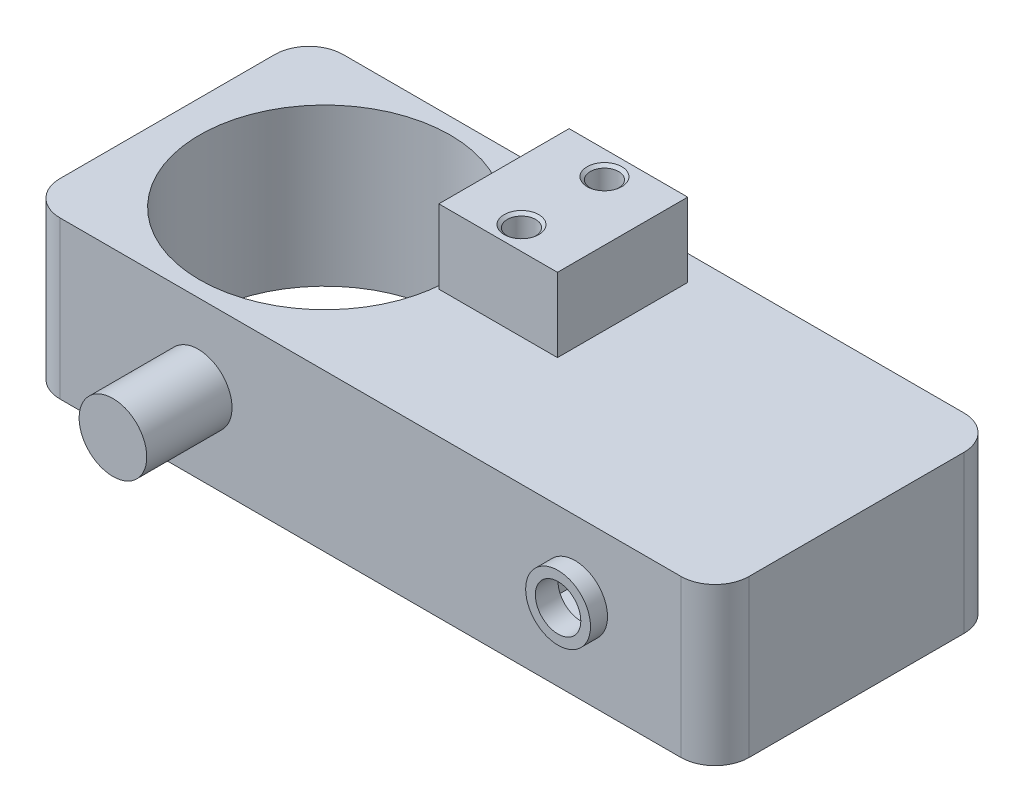
ISO-10303-21;
HEADER;
FILE_DESCRIPTION(('STEP AP214'),'2;1');
FILE_NAME('part.step','',(''),(''),'','','');
FILE_SCHEMA(('AUTOMOTIVE_DESIGN { 1 0 10303 214 1 1 1 1 }'));
ENDSEC;
DATA;
#1=APPLICATION_CONTEXT('core data for automotive mechanical design processes');
#2=APPLICATION_PROTOCOL_DEFINITION('international standard','automotive_design',2000,#1);
#3=PRODUCT_CONTEXT('',#1,'mechanical');
#4=PRODUCT('Part','Part','',(#3));
#5=PRODUCT_RELATED_PRODUCT_CATEGORY('part','',(#4));
#6=PRODUCT_DEFINITION_FORMATION('','',#4);
#7=PRODUCT_DEFINITION_CONTEXT('part definition',#1,'design');
#8=PRODUCT_DEFINITION('design','',#6,#7);
#9=PRODUCT_DEFINITION_SHAPE('','',#8);
#10=(LENGTH_UNIT() NAMED_UNIT(*) SI_UNIT(.MILLI.,.METRE.));
#11=(NAMED_UNIT(*) PLANE_ANGLE_UNIT() SI_UNIT($,.RADIAN.));
#12=(NAMED_UNIT(*) SI_UNIT($,.STERADIAN.) SOLID_ANGLE_UNIT());
#13=UNCERTAINTY_MEASURE_WITH_UNIT(LENGTH_MEASURE(1.E-05),#10,'distance_accuracy_value','');
#14=(GEOMETRIC_REPRESENTATION_CONTEXT(3) GLOBAL_UNCERTAINTY_ASSIGNED_CONTEXT((#13)) GLOBAL_UNIT_ASSIGNED_CONTEXT((#10,
#11,#12)) REPRESENTATION_CONTEXT('',''));
#15=CARTESIAN_POINT('',(0.,0.,0.));
#16=DIRECTION('',(0.,0.,1.));
#17=DIRECTION('',(1.,0.,0.));
#18=AXIS2_PLACEMENT_3D('',#15,#16,#17);
#19=CARTESIAN_POINT('',(-30.303823575,13.8,12.447970491281));
#20=DIRECTION('',(0.,0.,-1.));
#21=DIRECTION('',(-1.,0.,0.));
#22=AXIS2_PLACEMENT_3D('',#19,#20,#21);
#23=PLANE('',#22);
#24=DIRECTION('',(1.,0.,0.));
#25=VECTOR('',#24,1.);
#26=CARTESIAN_POINT('',(-30.303823575,0.,12.447970491281));
#27=LINE('',#26,#25);
#28=CARTESIAN_POINT('',(-27.303823575,0.,12.447970491281));
#29=VERTEX_POINT('',#28);
#30=CARTESIAN_POINT('',(27.303823575,0.,12.447970491281));
#31=VERTEX_POINT('',#30);
#32=EDGE_CURVE('E233',#29,#31,#27,.T.);
#33=ORIENTED_EDGE('',*,*,#32,.T.);
#34=DIRECTION('',(0.,-1.,0.));
#35=VECTOR('',#34,1.);
#36=CARTESIAN_POINT('',(27.303823575,13.8,12.447970491281));
#37=LINE('',#36,#35);
#38=CARTESIAN_POINT('',(27.303823575,13.8,12.447970491281));
#39=VERTEX_POINT('',#38);
#40=EDGE_CURVE('E56',#31,#39,#37,.F.);
#41=ORIENTED_EDGE('',*,*,#40,.T.);
#42=DIRECTION('',(1.,0.,0.));
#43=VECTOR('',#42,1.);
#44=CARTESIAN_POINT('',(-30.303823575,13.8,12.447970491281));
#45=LINE('',#44,#43);
#46=CARTESIAN_POINT('',(-27.303823575,13.8,12.447970491281));
#47=VERTEX_POINT('',#46);
#48=EDGE_CURVE('E238',#47,#39,#45,.T.);
#49=ORIENTED_EDGE('',*,*,#48,.F.);
#50=DIRECTION('',(0.,-1.,0.));
#51=VECTOR('',#50,1.);
#52=CARTESIAN_POINT('',(-27.303823575,13.8,12.447970491281));
#53=LINE('',#52,#51);
#54=EDGE_CURVE('E264',#47,#29,#53,.T.);
#55=ORIENTED_EDGE('',*,*,#54,.T.);
#56=EDGE_LOOP('',(#33,#41,#49,#55));
#57=FACE_BOUND('',#56,.T.);
#58=CARTESIAN_POINT('',(-15.1519117875,6.9,12.447970491281));
#59=DIRECTION('',(0.,0.,-1.));
#60=DIRECTION('',(-1.,0.,0.));
#61=AXIS2_PLACEMENT_3D('',#58,#59,#60);
#62=CIRCLE('',#61,2.975);
#63=CARTESIAN_POINT('',(-18.1269117875,6.9,12.447970491281));
#64=VERTEX_POINT('',#63);
#65=EDGE_CURVE('E240',#64,#64,#62,.F.);
#66=ORIENTED_EDGE('',*,*,#65,.F.);
#67=EDGE_LOOP('',(#66));
#68=FACE_BOUND('',#67,.T.);
#69=CARTESIAN_POINT('',(18.,7.5,12.447970491281));
#70=DIRECTION('',(0.,0.,-1.));
#71=DIRECTION('',(-1.,0.,0.));
#72=AXIS2_PLACEMENT_3D('',#69,#70,#71);
#73=CIRCLE('',#72,2.85048671445384);
#74=CARTESIAN_POINT('',(15.1495132855462,7.5,12.447970491281));
#75=VERTEX_POINT('',#74);
#76=EDGE_CURVE('E250',#75,#75,#73,.F.);
#77=ORIENTED_EDGE('',*,*,#76,.F.);
#78=EDGE_LOOP('',(#77));
#79=FACE_BOUND('',#78,.T.);
#80=ADVANCED_FACE('F48',(#57,#68,#79),#23,.F.);
#81=CARTESIAN_POINT('',(0.,13.8,0.));
#82=DIRECTION('',(0.,1.,0.));
#83=DIRECTION('',(0.,0.,1.));
#84=AXIS2_PLACEMENT_3D('',#81,#82,#83);
#85=PLANE('',#84);
#86=CARTESIAN_POINT('',(-16.4607542186155,13.8,0.));
#87=DIRECTION('',(0.,1.,0.));
#88=DIRECTION('',(0.,0.,1.));
#89=AXIS2_PLACEMENT_3D('',#86,#87,#88);
#90=CIRCLE('',#89,11.0264659042129);
#91=CARTESIAN_POINT('',(-16.4607542186155,13.8,11.0264659042129));
#92=VERTEX_POINT('',#91);
#93=EDGE_CURVE('E752',#92,#92,#90,.T.);
#94=ORIENTED_EDGE('',*,*,#93,.F.);
#95=EDGE_LOOP('',(#94));
#96=FACE_BOUND('',#95,.T.);
#97=ORIENTED_EDGE('',*,*,#48,.T.);
#98=CARTESIAN_POINT('',(27.303823575,13.8,9.44797049128098));
#99=DIRECTION('',(0.,1.,0.));
#100=DIRECTION('',(0.,0.,1.));
#101=AXIS2_PLACEMENT_3D('',#98,#99,#100);
#102=CIRCLE('',#101,3.);
#103=CARTESIAN_POINT('',(30.303823575,13.8,9.44797049128097));
#104=VERTEX_POINT('',#103);
#105=EDGE_CURVE('E11',#39,#104,#102,.T.);
#106=ORIENTED_EDGE('',*,*,#105,.T.);
#107=DIRECTION('',(0.,0.,-1.));
#108=VECTOR('',#107,1.);
#109=CARTESIAN_POINT('',(30.303823575,13.8,-12.447970491281));
#110=LINE('',#109,#108);
#111=CARTESIAN_POINT('',(30.303823575,13.8,-9.44797049128098));
#112=VERTEX_POINT('',#111);
#113=EDGE_CURVE('E230',#104,#112,#110,.T.);
#114=ORIENTED_EDGE('',*,*,#113,.T.);
#115=CARTESIAN_POINT('',(27.303823575,13.8,-9.44797049128098));
#116=DIRECTION('',(0.,1.,0.));
#117=DIRECTION('',(0.,0.,1.));
#118=AXIS2_PLACEMENT_3D('',#115,#116,#117);
#119=CIRCLE('',#118,3.);
#120=CARTESIAN_POINT('',(27.303823575,13.8,-12.447970491281));
#121=VERTEX_POINT('',#120);
#122=EDGE_CURVE('E282',#112,#121,#119,.T.);
#123=ORIENTED_EDGE('',*,*,#122,.T.);
#124=DIRECTION('',(-1.,0.,0.));
#125=VECTOR('',#124,1.);
#126=CARTESIAN_POINT('',(-30.303823575,13.8,-12.447970491281));
#127=LINE('',#126,#125);
#128=CARTESIAN_POINT('',(-27.303823575,13.8,-12.447970491281));
#129=VERTEX_POINT('',#128);
#130=EDGE_CURVE('E232',#121,#129,#127,.T.);
#131=ORIENTED_EDGE('',*,*,#130,.T.);
#132=CARTESIAN_POINT('',(-27.303823575,13.8,-9.44797049128098));
#133=DIRECTION('',(0.,1.,0.));
#134=DIRECTION('',(0.,0.,1.));
#135=AXIS2_PLACEMENT_3D('',#132,#133,#134);
#136=CIRCLE('',#135,3.);
#137=CARTESIAN_POINT('',(-30.303823575,13.8,-9.44797049128099));
#138=VERTEX_POINT('',#137);
#139=EDGE_CURVE('E262',#129,#138,#136,.T.);
#140=ORIENTED_EDGE('',*,*,#139,.T.);
#141=DIRECTION('',(0.,0.,1.));
#142=VECTOR('',#141,1.);
#143=CARTESIAN_POINT('',(-30.303823575,13.8,-12.447970491281));
#144=LINE('',#143,#142);
#145=CARTESIAN_POINT('',(-30.303823575,13.8,9.44797049128098));
#146=VERTEX_POINT('',#145);
#147=EDGE_CURVE('E235',#138,#146,#144,.T.);
#148=ORIENTED_EDGE('',*,*,#147,.T.);
#149=CARTESIAN_POINT('',(-27.303823575,13.8,9.44797049128098));
#150=DIRECTION('',(0.,1.,0.));
#151=DIRECTION('',(0.,0.,1.));
#152=AXIS2_PLACEMENT_3D('',#149,#150,#151);
#153=CIRCLE('',#152,3.);
#154=EDGE_CURVE('E271',#146,#47,#153,.T.);
#155=ORIENTED_EDGE('',*,*,#154,.T.);
#156=EDGE_LOOP('',(#97,#106,#114,#123,#131,#140,#148,#155));
#157=FACE_BOUND('',#156,.T.);
#158=DIRECTION('',(-1.,0.,0.));
#159=VECTOR('',#158,1.);
#160=CARTESIAN_POINT('',(-5.21581759771795,13.8,-10.2392448863649));
#161=LINE('',#160,#159);
#162=CARTESIAN_POINT('',(5.21581759771795,13.8,-10.2392448863649));
#163=VERTEX_POINT('',#162);
#164=CARTESIAN_POINT('',(-5.21581759771795,13.8,-10.2392448863649));
#165=VERTEX_POINT('',#164);
#166=EDGE_CURVE('E787',#163,#165,#161,.T.);
#167=ORIENTED_EDGE('',*,*,#166,.F.);
#168=DIRECTION('',(0.,0.,-1.));
#169=VECTOR('',#168,1.);
#170=CARTESIAN_POINT('',(5.21581759771795,13.8,-10.2392448863649));
#171=LINE('',#170,#169);
#172=CARTESIAN_POINT('',(5.21581759771795,13.8,1.2174642878132));
#173=VERTEX_POINT('',#172);
#174=EDGE_CURVE('E184',#173,#163,#171,.T.);
#175=ORIENTED_EDGE('',*,*,#174,.F.);
#176=DIRECTION('',(1.,0.,0.));
#177=VECTOR('',#176,1.);
#178=CARTESIAN_POINT('',(-5.21581759771795,13.8,1.2174642878132));
#179=LINE('',#178,#177);
#180=CARTESIAN_POINT('',(-5.21581759771795,13.8,1.2174642878132));
#181=VERTEX_POINT('',#180);
#182=EDGE_CURVE('E180',#181,#173,#179,.T.);
#183=ORIENTED_EDGE('',*,*,#182,.F.);
#184=DIRECTION('',(0.,0.,1.));
#185=VECTOR('',#184,1.);
#186=CARTESIAN_POINT('',(-5.21581759771795,13.8,-10.2392448863649));
#187=LINE('',#186,#185);
#188=EDGE_CURVE('E789',#165,#181,#187,.T.);
#189=ORIENTED_EDGE('',*,*,#188,.F.);
#190=EDGE_LOOP('',(#167,#175,#183,#189));
#191=FACE_BOUND('',#190,.T.);
#192=ADVANCED_FACE('F302',(#96,#157,#191),#85,.T.);
#193=CARTESIAN_POINT('',(24.25,12.75,-12.447970491281));
#194=DIRECTION('',(1.,0.,0.));
#195=DIRECTION('',(0.,0.,-1.));
#196=AXIS2_PLACEMENT_3D('',#193,#194,#195);
#197=PLANE('',#196);
#198=DIRECTION('',(0.,1.,0.));
#199=VECTOR('',#198,1.);
#200=CARTESIAN_POINT('',(24.25,12.75,11.947970491281));
#201=LINE('',#200,#199);
#202=CARTESIAN_POINT('',(24.25,2.25,11.947970491281));
#203=VERTEX_POINT('',#202);
#204=CARTESIAN_POINT('',(24.25,12.75,11.947970491281));
#205=VERTEX_POINT('',#204);
#206=EDGE_CURVE('E197',#203,#205,#201,.T.);
#207=ORIENTED_EDGE('',*,*,#206,.T.);
#208=DIRECTION('',(0.,0.,1.));
#209=VECTOR('',#208,1.);
#210=CARTESIAN_POINT('',(24.25,12.75,-12.447970491281));
#211=LINE('',#210,#209);
#212=CARTESIAN_POINT('',(24.25,12.75,-12.447970491281));
#213=VERTEX_POINT('',#212);
#214=EDGE_CURVE('E218',#213,#205,#211,.T.);
#215=ORIENTED_EDGE('',*,*,#214,.F.);
#216=DIRECTION('',(0.,1.,0.));
#217=VECTOR('',#216,1.);
#218=CARTESIAN_POINT('',(24.25,12.75,-12.447970491281));
#219=LINE('',#218,#217);
#220=CARTESIAN_POINT('',(24.25,2.25,-12.447970491281));
#221=VERTEX_POINT('',#220);
#222=EDGE_CURVE('E206',#221,#213,#219,.T.);
#223=ORIENTED_EDGE('',*,*,#222,.F.);
#224=DIRECTION('',(0.,0.,1.));
#225=VECTOR('',#224,1.);
#226=CARTESIAN_POINT('',(24.25,2.25,-12.447970491281));
#227=LINE('',#226,#225);
#228=EDGE_CURVE('E219',#221,#203,#227,.T.);
#229=ORIENTED_EDGE('',*,*,#228,.T.);
#230=EDGE_LOOP('',(#207,#215,#223,#229));
#231=FACE_BOUND('',#230,.T.);
#232=ADVANCED_FACE('F331',(#231),#197,.F.);
#233=CARTESIAN_POINT('',(11.75,2.25,-12.447970491281));
#234=DIRECTION('',(0.,-1.,0.));
#235=DIRECTION('',(0.,0.,-1.));
#236=AXIS2_PLACEMENT_3D('',#233,#234,#235);
#237=PLANE('',#236);
#238=DIRECTION('',(1.,0.,0.));
#239=VECTOR('',#238,1.);
#240=CARTESIAN_POINT('',(11.75,2.25,11.947970491281));
#241=LINE('',#240,#239);
#242=CARTESIAN_POINT('',(11.75,2.25,11.947970491281));
#243=VERTEX_POINT('',#242);
#244=EDGE_CURVE('E204',#243,#203,#241,.T.);
#245=ORIENTED_EDGE('',*,*,#244,.T.);
#246=ORIENTED_EDGE('',*,*,#228,.F.);
#247=DIRECTION('',(1.,0.,0.));
#248=VECTOR('',#247,1.);
#249=CARTESIAN_POINT('',(11.75,2.25,-12.447970491281));
#250=LINE('',#249,#248);
#251=CARTESIAN_POINT('',(11.75,2.25,-12.447970491281));
#252=VERTEX_POINT('',#251);
#253=EDGE_CURVE('E215',#252,#221,#250,.T.);
#254=ORIENTED_EDGE('',*,*,#253,.F.);
#255=DIRECTION('',(0.,0.,1.));
#256=VECTOR('',#255,1.);
#257=CARTESIAN_POINT('',(11.75,2.25,-12.447970491281));
#258=LINE('',#257,#256);
#259=EDGE_CURVE('E223',#252,#243,#258,.T.);
#260=ORIENTED_EDGE('',*,*,#259,.T.);
#261=EDGE_LOOP('',(#245,#246,#254,#260));
#262=FACE_BOUND('',#261,.T.);
#263=ADVANCED_FACE('F394',(#262),#237,.F.);
#264=CARTESIAN_POINT('',(11.75,12.75,-12.447970491281));
#265=DIRECTION('',(-1.,0.,0.));
#266=DIRECTION('',(0.,-1.,0.));
#267=AXIS2_PLACEMENT_3D('',#264,#265,#266);
#268=PLANE('',#267);
#269=DIRECTION('',(0.,-1.,0.));
#270=VECTOR('',#269,1.);
#271=CARTESIAN_POINT('',(11.75,12.75,11.947970491281));
#272=LINE('',#271,#270);
#273=CARTESIAN_POINT('',(11.75,12.75,11.947970491281));
#274=VERTEX_POINT('',#273);
#275=EDGE_CURVE('E202',#274,#243,#272,.T.);
#276=ORIENTED_EDGE('',*,*,#275,.T.);
#277=ORIENTED_EDGE('',*,*,#259,.F.);
#278=DIRECTION('',(0.,-1.,0.));
#279=VECTOR('',#278,1.);
#280=CARTESIAN_POINT('',(11.75,12.75,-12.447970491281));
#281=LINE('',#280,#279);
#282=CARTESIAN_POINT('',(11.75,12.75,-12.447970491281));
#283=VERTEX_POINT('',#282);
#284=EDGE_CURVE('E212',#283,#252,#281,.T.);
#285=ORIENTED_EDGE('',*,*,#284,.F.);
#286=DIRECTION('',(0.,0.,1.));
#287=VECTOR('',#286,1.);
#288=CARTESIAN_POINT('',(11.75,12.75,-12.447970491281));
#289=LINE('',#288,#287);
#290=EDGE_CURVE('E226',#283,#274,#289,.T.);
#291=ORIENTED_EDGE('',*,*,#290,.T.);
#292=EDGE_LOOP('',(#276,#277,#285,#291));
#293=FACE_BOUND('',#292,.T.);
#294=ADVANCED_FACE('F402',(#293),#268,.F.);
#295=CARTESIAN_POINT('',(11.75,12.75,-12.447970491281));
#296=DIRECTION('',(0.,1.,0.));
#297=DIRECTION('',(0.,0.,1.));
#298=AXIS2_PLACEMENT_3D('',#295,#296,#297);
#299=PLANE('',#298);
#300=DIRECTION('',(-1.,0.,0.));
#301=VECTOR('',#300,1.);
#302=CARTESIAN_POINT('',(11.75,12.75,11.947970491281));
#303=LINE('',#302,#301);
#304=EDGE_CURVE('E200',#205,#274,#303,.T.);
#305=ORIENTED_EDGE('',*,*,#304,.T.);
#306=ORIENTED_EDGE('',*,*,#290,.F.);
#307=DIRECTION('',(-1.,0.,0.));
#308=VECTOR('',#307,1.);
#309=CARTESIAN_POINT('',(11.75,12.75,-12.447970491281));
#310=LINE('',#309,#308);
#311=EDGE_CURVE('E209',#213,#283,#310,.T.);
#312=ORIENTED_EDGE('',*,*,#311,.F.);
#313=ORIENTED_EDGE('',*,*,#214,.T.);
#314=EDGE_LOOP('',(#305,#306,#312,#313));
#315=FACE_BOUND('',#314,.T.);
#316=ADVANCED_FACE('F343',(#315),#299,.F.);
#317=CARTESIAN_POINT('',(30.303823575,13.8,-12.447970491281));
#318=DIRECTION('',(-1.,0.,0.));
#319=DIRECTION('',(0.,0.,1.));
#320=AXIS2_PLACEMENT_3D('',#317,#318,#319);
#321=PLANE('',#320);
#322=ORIENTED_EDGE('',*,*,#113,.F.);
#323=DIRECTION('',(0.,-1.,0.));
#324=VECTOR('',#323,1.);
#325=CARTESIAN_POINT('',(30.303823575,13.8,9.44797049128098));
#326=LINE('',#325,#324);
#327=CARTESIAN_POINT('',(30.303823575,0.,9.44797049128097));
#328=VERTEX_POINT('',#327);
#329=EDGE_CURVE('E284',#104,#328,#326,.T.);
#330=ORIENTED_EDGE('',*,*,#329,.T.);
#331=DIRECTION('',(0.,0.,-1.));
#332=VECTOR('',#331,1.);
#333=CARTESIAN_POINT('',(30.303823575,0.,-12.447970491281));
#334=LINE('',#333,#332);
#335=CARTESIAN_POINT('',(30.303823575,0.,-9.44797049128098));
#336=VERTEX_POINT('',#335);
#337=EDGE_CURVE('E222',#328,#336,#334,.T.);
#338=ORIENTED_EDGE('',*,*,#337,.T.);
#339=DIRECTION('',(0.,-1.,0.));
#340=VECTOR('',#339,1.);
#341=CARTESIAN_POINT('',(30.303823575,13.8,-9.44797049128098));
#342=LINE('',#341,#340);
#343=EDGE_CURVE('E279',#336,#112,#342,.F.);
#344=ORIENTED_EDGE('',*,*,#343,.T.);
#345=EDGE_LOOP('',(#322,#330,#338,#344));
#346=FACE_BOUND('',#345,.T.);
#347=ADVANCED_FACE('F290',(#346),#321,.F.);
#348=CARTESIAN_POINT('',(-30.303823575,13.8,-12.447970491281));
#349=DIRECTION('',(0.,0.,1.));
#350=DIRECTION('',(1.,0.,0.));
#351=AXIS2_PLACEMENT_3D('',#348,#349,#350);
#352=PLANE('',#351);
#353=ORIENTED_EDGE('',*,*,#253,.T.);
#354=ORIENTED_EDGE('',*,*,#222,.T.);
#355=ORIENTED_EDGE('',*,*,#311,.T.);
#356=ORIENTED_EDGE('',*,*,#284,.T.);
#357=EDGE_LOOP('',(#353,#354,#355,#356));
#358=FACE_BOUND('',#357,.T.);
#359=ORIENTED_EDGE('',*,*,#130,.F.);
#360=DIRECTION('',(0.,-1.,0.));
#361=VECTOR('',#360,1.);
#362=CARTESIAN_POINT('',(27.303823575,13.8,-12.447970491281));
#363=LINE('',#362,#361);
#364=CARTESIAN_POINT('',(27.303823575,0.,-12.447970491281));
#365=VERTEX_POINT('',#364);
#366=EDGE_CURVE('E273',#121,#365,#363,.T.);
#367=ORIENTED_EDGE('',*,*,#366,.T.);
#368=DIRECTION('',(-1.,0.,0.));
#369=VECTOR('',#368,1.);
#370=CARTESIAN_POINT('',(-30.303823575,0.,-12.447970491281));
#371=LINE('',#370,#369);
#372=CARTESIAN_POINT('',(-27.303823575,0.,-12.447970491281));
#373=VERTEX_POINT('',#372);
#374=EDGE_CURVE('E242',#365,#373,#371,.T.);
#375=ORIENTED_EDGE('',*,*,#374,.T.);
#376=DIRECTION('',(0.,-1.,0.));
#377=VECTOR('',#376,1.);
#378=CARTESIAN_POINT('',(-27.303823575,13.8,-12.447970491281));
#379=LINE('',#378,#377);
#380=EDGE_CURVE('E259',#373,#129,#379,.F.);
#381=ORIENTED_EDGE('',*,*,#380,.T.);
#382=EDGE_LOOP('',(#359,#367,#375,#381));
#383=FACE_BOUND('',#382,.T.);
#384=ADVANCED_FACE('F305',(#358,#383),#352,.F.);
#385=CARTESIAN_POINT('',(-30.303823575,13.8,-12.447970491281));
#386=DIRECTION('',(1.,0.,0.));
#387=DIRECTION('',(0.,0.,-1.));
#388=AXIS2_PLACEMENT_3D('',#385,#386,#387);
#389=PLANE('',#388);
#390=DIRECTION('',(0.,0.,1.));
#391=VECTOR('',#390,1.);
#392=CARTESIAN_POINT('',(-30.303823575,0.,-12.447970491281));
#393=LINE('',#392,#391);
#394=CARTESIAN_POINT('',(-30.303823575,0.,-9.44797049128099));
#395=VERTEX_POINT('',#394);
#396=CARTESIAN_POINT('',(-30.303823575,0.,9.44797049128098));
#397=VERTEX_POINT('',#396);
#398=EDGE_CURVE('E244',#395,#397,#393,.T.);
#399=ORIENTED_EDGE('',*,*,#398,.T.);
#400=DIRECTION('',(0.,-1.,0.));
#401=VECTOR('',#400,1.);
#402=CARTESIAN_POINT('',(-30.303823575,13.8,9.44797049128098));
#403=LINE('',#402,#401);
#404=EDGE_CURVE('E269',#397,#146,#403,.F.);
#405=ORIENTED_EDGE('',*,*,#404,.T.);
#406=ORIENTED_EDGE('',*,*,#147,.F.);
#407=DIRECTION('',(0.,-1.,0.));
#408=VECTOR('',#407,1.);
#409=CARTESIAN_POINT('',(-30.303823575,13.8,-9.44797049128098));
#410=LINE('',#409,#408);
#411=EDGE_CURVE('E253',#138,#395,#410,.T.);
#412=ORIENTED_EDGE('',*,*,#411,.T.);
#413=EDGE_LOOP('',(#399,#405,#406,#412));
#414=FACE_BOUND('',#413,.T.);
#415=ADVANCED_FACE('F314',(#414),#389,.F.);
#416=CARTESIAN_POINT('',(0.,0.,0.));
#417=DIRECTION('',(0.,1.,0.));
#418=DIRECTION('',(0.,0.,1.));
#419=AXIS2_PLACEMENT_3D('',#416,#417,#418);
#420=PLANE('',#419);
#421=CARTESIAN_POINT('',(-16.4607542186155,0.,0.));
#422=DIRECTION('',(0.,-1.,0.));
#423=DIRECTION('',(0.,0.,-1.));
#424=AXIS2_PLACEMENT_3D('',#421,#422,#423);
#425=CIRCLE('',#424,11.0264659042129);
#426=CARTESIAN_POINT('',(-16.4607542186155,0.,-11.0264659042129));
#427=VERTEX_POINT('',#426);
#428=EDGE_CURVE('E755',#427,#427,#425,.T.);
#429=ORIENTED_EDGE('',*,*,#428,.F.);
#430=EDGE_LOOP('',(#429));
#431=FACE_BOUND('',#430,.T.);
#432=CARTESIAN_POINT('',(0.,0.,-0.832683669671331));
#433=DIRECTION('',(0.,1.,0.));
#434=DIRECTION('',(0.,0.,1.));
#435=AXIS2_PLACEMENT_3D('',#432,#433,#434);
#436=CIRCLE('',#435,1.25);
#437=CARTESIAN_POINT('',(0.,0.,0.417316330328665));
#438=VERTEX_POINT('',#437);
#439=EDGE_CURVE('E771',#438,#438,#436,.T.);
#440=ORIENTED_EDGE('',*,*,#439,.T.);
#441=EDGE_LOOP('',(#440));
#442=FACE_BOUND('',#441,.T.);
#443=CARTESIAN_POINT('',(0.,0.,-8.13268366967133));
#444=DIRECTION('',(0.,1.,0.));
#445=DIRECTION('',(0.,0.,1.));
#446=AXIS2_PLACEMENT_3D('',#443,#444,#445);
#447=CIRCLE('',#446,1.25);
#448=CARTESIAN_POINT('',(0.,0.,-6.88268366967133));
#449=VERTEX_POINT('',#448);
#450=EDGE_CURVE('E780',#449,#449,#447,.T.);
#451=ORIENTED_EDGE('',*,*,#450,.T.);
#452=EDGE_LOOP('',(#451));
#453=FACE_BOUND('',#452,.T.);
#454=ORIENTED_EDGE('',*,*,#337,.F.);
#455=CARTESIAN_POINT('',(27.303823575,0.,9.44797049128098));
#456=DIRECTION('',(0.,1.,0.));
#457=DIRECTION('',(0.,0.,1.));
#458=AXIS2_PLACEMENT_3D('',#455,#456,#457);
#459=CIRCLE('',#458,3.);
#460=EDGE_CURVE('E70',#328,#31,#459,.F.);
#461=ORIENTED_EDGE('',*,*,#460,.T.);
#462=ORIENTED_EDGE('',*,*,#32,.F.);
#463=CARTESIAN_POINT('',(-27.303823575,0.,9.44797049128098));
#464=DIRECTION('',(0.,1.,0.));
#465=DIRECTION('',(0.,0.,1.));
#466=AXIS2_PLACEMENT_3D('',#463,#464,#465);
#467=CIRCLE('',#466,3.);
#468=EDGE_CURVE('E267',#29,#397,#467,.F.);
#469=ORIENTED_EDGE('',*,*,#468,.T.);
#470=ORIENTED_EDGE('',*,*,#398,.F.);
#471=CARTESIAN_POINT('',(-27.303823575,0.,-9.44797049128098));
#472=DIRECTION('',(0.,1.,0.));
#473=DIRECTION('',(0.,0.,1.));
#474=AXIS2_PLACEMENT_3D('',#471,#472,#473);
#475=CIRCLE('',#474,3.);
#476=EDGE_CURVE('E256',#395,#373,#475,.F.);
#477=ORIENTED_EDGE('',*,*,#476,.T.);
#478=ORIENTED_EDGE('',*,*,#374,.F.);
#479=CARTESIAN_POINT('',(27.303823575,0.,-9.44797049128098));
#480=DIRECTION('',(0.,1.,0.));
#481=DIRECTION('',(0.,0.,1.));
#482=AXIS2_PLACEMENT_3D('',#479,#480,#481);
#483=CIRCLE('',#482,3.);
#484=EDGE_CURVE('E276',#365,#336,#483,.F.);
#485=ORIENTED_EDGE('',*,*,#484,.T.);
#486=EDGE_LOOP('',(#454,#461,#462,#469,#470,#477,#478,#485));
#487=FACE_BOUND('',#486,.T.);
#488=ADVANCED_FACE('F293',(#431,#442,#453,#487),#420,.F.);
#489=CARTESIAN_POINT('',(0.,0.,11.947970491281));
#490=DIRECTION('',(0.,0.,1.));
#491=DIRECTION('',(1.,0.,0.));
#492=AXIS2_PLACEMENT_3D('',#489,#490,#491);
#493=PLANE('',#492);
#494=CARTESIAN_POINT('',(18.,7.5,11.947970491281));
#495=DIRECTION('',(0.,0.,-1.));
#496=DIRECTION('',(-1.,0.,0.));
#497=AXIS2_PLACEMENT_3D('',#494,#495,#496);
#498=CIRCLE('',#497,2.);
#499=CARTESIAN_POINT('',(16.,7.5,11.947970491281));
#500=VERTEX_POINT('',#499);
#501=EDGE_CURVE('E189',#500,#500,#498,.T.);
#502=ORIENTED_EDGE('',*,*,#501,.F.);
#503=EDGE_LOOP('',(#502));
#504=FACE_BOUND('',#503,.T.);
#505=ORIENTED_EDGE('',*,*,#206,.F.);
#506=ORIENTED_EDGE('',*,*,#244,.F.);
#507=ORIENTED_EDGE('',*,*,#275,.F.);
#508=ORIENTED_EDGE('',*,*,#304,.F.);
#509=EDGE_LOOP('',(#505,#506,#507,#508));
#510=FACE_BOUND('',#509,.T.);
#511=ADVANCED_FACE('F370',(#504,#510),#493,.F.);
#512=CARTESIAN_POINT('',(18.,7.5,12.447970491281));
#513=DIRECTION('',(0.,0.,-1.));
#514=DIRECTION('',(-1.,0.,0.));
#515=AXIS2_PLACEMENT_3D('',#512,#513,#514);
#516=CYLINDRICAL_SURFACE('',#515,2.);
#517=ORIENTED_EDGE('',*,*,#501,.T.);
#518=EDGE_LOOP('',(#517));
#519=FACE_BOUND('',#518,.T.);
#520=CARTESIAN_POINT('',(18.,7.5,13.947970491281));
#521=DIRECTION('',(0.,0.,1.));
#522=DIRECTION('',(1.,0.,0.));
#523=AXIS2_PLACEMENT_3D('',#520,#521,#522);
#524=CIRCLE('',#523,2.);
#525=CARTESIAN_POINT('',(20.,7.5,13.947970491281));
#526=VERTEX_POINT('',#525);
#527=EDGE_CURVE('E757',#526,#526,#524,.T.);
#528=ORIENTED_EDGE('',*,*,#527,.T.);
#529=EDGE_LOOP('',(#528));
#530=FACE_BOUND('',#529,.T.);
#531=ADVANCED_FACE('F450',(#519,#530),#516,.F.);
#532=CARTESIAN_POINT('',(-15.1519117875,6.9,19.947970491281));
#533=DIRECTION('',(0.,0.,-1.));
#534=DIRECTION('',(-1.,0.,0.));
#535=AXIS2_PLACEMENT_3D('',#532,#533,#534);
#536=CYLINDRICAL_SURFACE('',#535,2.975);
#537=CARTESIAN_POINT('',(-15.1519117875,6.9,19.947970491281));
#538=DIRECTION('',(0.,0.,1.));
#539=DIRECTION('',(1.,0.,0.));
#540=AXIS2_PLACEMENT_3D('',#537,#538,#539);
#541=CIRCLE('',#540,2.975);
#542=CARTESIAN_POINT('',(-12.1769117875,6.9,19.947970491281));
#543=VERTEX_POINT('',#542);
#544=EDGE_CURVE('E186',#543,#543,#541,.T.);
#545=ORIENTED_EDGE('',*,*,#544,.F.);
#546=EDGE_LOOP('',(#545));
#547=FACE_BOUND('',#546,.T.);
#548=ORIENTED_EDGE('',*,*,#65,.T.);
#549=EDGE_LOOP('',(#548));
#550=FACE_BOUND('',#549,.T.);
#551=ADVANCED_FACE('F461',(#547,#550),#536,.T.);
#552=CARTESIAN_POINT('',(-15.1519117875,6.9,19.947970491281));
#553=DIRECTION('',(0.,0.,1.));
#554=DIRECTION('',(1.,0.,0.));
#555=AXIS2_PLACEMENT_3D('',#552,#553,#554);
#556=PLANE('',#555);
#557=ORIENTED_EDGE('',*,*,#544,.T.);
#558=EDGE_LOOP('',(#557));
#559=FACE_BOUND('',#558,.T.);
#560=ADVANCED_FACE('F472',(#559),#556,.T.);
#561=CARTESIAN_POINT('',(5.21581759771795,20.3,-10.2392448863649));
#562=DIRECTION('',(-1.,0.,0.));
#563=DIRECTION('',(0.,0.,1.));
#564=AXIS2_PLACEMENT_3D('',#561,#562,#563);
#565=PLANE('',#564);
#566=ORIENTED_EDGE('',*,*,#174,.T.);
#567=DIRECTION('',(0.,-1.,0.));
#568=VECTOR('',#567,1.);
#569=CARTESIAN_POINT('',(5.21581759771795,20.3,-10.2392448863649));
#570=LINE('',#569,#568);
#571=CARTESIAN_POINT('',(5.21581759771795,20.3,-10.2392448863649));
#572=VERTEX_POINT('',#571);
#573=EDGE_CURVE('E164',#572,#163,#570,.T.);
#574=ORIENTED_EDGE('',*,*,#573,.F.);
#575=DIRECTION('',(0.,0.,-1.));
#576=VECTOR('',#575,1.);
#577=CARTESIAN_POINT('',(5.21581759771795,20.3,-10.2392448863649));
#578=LINE('',#577,#576);
#579=CARTESIAN_POINT('',(5.21581759771795,20.3,1.2174642878132));
#580=VERTEX_POINT('',#579);
#581=EDGE_CURVE('E171',#580,#572,#578,.T.);
#582=ORIENTED_EDGE('',*,*,#581,.F.);
#583=DIRECTION('',(0.,-1.,0.));
#584=VECTOR('',#583,1.);
#585=CARTESIAN_POINT('',(5.21581759771795,20.3,1.2174642878132));
#586=LINE('',#585,#584);
#587=EDGE_CURVE('E785',#580,#173,#586,.T.);
#588=ORIENTED_EDGE('',*,*,#587,.T.);
#589=EDGE_LOOP('',(#566,#574,#582,#588));
#590=FACE_BOUND('',#589,.T.);
#591=ADVANCED_FACE('F182',(#590),#565,.F.);
#592=CARTESIAN_POINT('',(-5.21581759771795,20.3,-10.2392448863649));
#593=DIRECTION('',(0.,0.,1.));
#594=DIRECTION('',(1.,0.,0.));
#595=AXIS2_PLACEMENT_3D('',#592,#593,#594);
#596=PLANE('',#595);
#597=ORIENTED_EDGE('',*,*,#166,.T.);
#598=DIRECTION('',(0.,-1.,0.));
#599=VECTOR('',#598,1.);
#600=CARTESIAN_POINT('',(-5.21581759771795,20.3,-10.2392448863649));
#601=LINE('',#600,#599);
#602=CARTESIAN_POINT('',(-5.21581759771795,20.3,-10.2392448863649));
#603=VERTEX_POINT('',#602);
#604=EDGE_CURVE('E167',#603,#165,#601,.T.);
#605=ORIENTED_EDGE('',*,*,#604,.F.);
#606=DIRECTION('',(-1.,0.,0.));
#607=VECTOR('',#606,1.);
#608=CARTESIAN_POINT('',(-5.21581759771795,20.3,-10.2392448863649));
#609=LINE('',#608,#607);
#610=EDGE_CURVE('E160',#572,#603,#609,.T.);
#611=ORIENTED_EDGE('',*,*,#610,.F.);
#612=ORIENTED_EDGE('',*,*,#573,.T.);
#613=EDGE_LOOP('',(#597,#605,#611,#612));
#614=FACE_BOUND('',#613,.T.);
#615=ADVANCED_FACE('F162',(#614),#596,.F.);
#616=CARTESIAN_POINT('',(-5.21581759771795,20.3,-10.2392448863649));
#617=DIRECTION('',(1.,0.,0.));
#618=DIRECTION('',(0.,0.,-1.));
#619=AXIS2_PLACEMENT_3D('',#616,#617,#618);
#620=PLANE('',#619);
#621=ORIENTED_EDGE('',*,*,#188,.T.);
#622=DIRECTION('',(0.,-1.,0.));
#623=VECTOR('',#622,1.);
#624=CARTESIAN_POINT('',(-5.21581759771795,20.3,1.2174642878132));
#625=LINE('',#624,#623);
#626=CARTESIAN_POINT('',(-5.21581759771795,20.3,1.2174642878132));
#627=VERTEX_POINT('',#626);
#628=EDGE_CURVE('E191',#627,#181,#625,.T.);
#629=ORIENTED_EDGE('',*,*,#628,.F.);
#630=DIRECTION('',(0.,0.,1.));
#631=VECTOR('',#630,1.);
#632=CARTESIAN_POINT('',(-5.21581759771795,20.3,-10.2392448863649));
#633=LINE('',#632,#631);
#634=EDGE_CURVE('E170',#603,#627,#633,.T.);
#635=ORIENTED_EDGE('',*,*,#634,.F.);
#636=ORIENTED_EDGE('',*,*,#604,.T.);
#637=EDGE_LOOP('',(#621,#629,#635,#636));
#638=FACE_BOUND('',#637,.T.);
#639=ADVANCED_FACE('F499',(#638),#620,.F.);
#640=CARTESIAN_POINT('',(-5.21581759771795,20.3,1.2174642878132));
#641=DIRECTION('',(0.,0.,-1.));
#642=DIRECTION('',(-1.,0.,0.));
#643=AXIS2_PLACEMENT_3D('',#640,#641,#642);
#644=PLANE('',#643);
#645=ORIENTED_EDGE('',*,*,#182,.T.);
#646=ORIENTED_EDGE('',*,*,#587,.F.);
#647=DIRECTION('',(1.,0.,0.));
#648=VECTOR('',#647,1.);
#649=CARTESIAN_POINT('',(-5.21581759771795,20.3,1.2174642878132));
#650=LINE('',#649,#648);
#651=EDGE_CURVE('E176',#627,#580,#650,.T.);
#652=ORIENTED_EDGE('',*,*,#651,.F.);
#653=ORIENTED_EDGE('',*,*,#628,.T.);
#654=EDGE_LOOP('',(#645,#646,#652,#653));
#655=FACE_BOUND('',#654,.T.);
#656=ADVANCED_FACE('F508',(#655),#644,.F.);
#657=CARTESIAN_POINT('',(0.,20.3,0.));
#658=DIRECTION('',(0.,1.,0.));
#659=DIRECTION('',(0.,0.,1.));
#660=AXIS2_PLACEMENT_3D('',#657,#658,#659);
#661=PLANE('',#660);
#662=CARTESIAN_POINT('',(0.,20.3,-0.832683669671331));
#663=DIRECTION('',(0.,1.,0.));
#664=DIRECTION('',(0.,0.,1.));
#665=AXIS2_PLACEMENT_3D('',#662,#663,#664);
#666=CIRCLE('',#665,1.525);
#667=CARTESIAN_POINT('',(0.,20.3,0.692316330328669));
#668=VERTEX_POINT('',#667);
#669=EDGE_CURVE('E765',#668,#668,#666,.T.);
#670=ORIENTED_EDGE('',*,*,#669,.F.);
#671=EDGE_LOOP('',(#670));
#672=FACE_BOUND('',#671,.T.);
#673=CARTESIAN_POINT('',(0.,20.3,-8.13268366967133));
#674=DIRECTION('',(0.,1.,0.));
#675=DIRECTION('',(0.,0.,1.));
#676=AXIS2_PLACEMENT_3D('',#673,#674,#675);
#677=CIRCLE('',#676,1.525);
#678=CARTESIAN_POINT('',(0.,20.3,-6.60768366967133));
#679=VERTEX_POINT('',#678);
#680=EDGE_CURVE('E774',#679,#679,#677,.T.);
#681=ORIENTED_EDGE('',*,*,#680,.F.);
#682=EDGE_LOOP('',(#681));
#683=FACE_BOUND('',#682,.T.);
#684=ORIENTED_EDGE('',*,*,#581,.T.);
#685=ORIENTED_EDGE('',*,*,#610,.T.);
#686=ORIENTED_EDGE('',*,*,#634,.T.);
#687=ORIENTED_EDGE('',*,*,#651,.T.);
#688=EDGE_LOOP('',(#684,#685,#686,#687));
#689=FACE_BOUND('',#688,.T.);
#690=ADVANCED_FACE('F174',(#672,#683,#689),#661,.T.);
#691=CARTESIAN_POINT('',(0.,20.3,-8.13268366967133));
#692=DIRECTION('',(0.,1.,0.));
#693=DIRECTION('',(0.,0.,1.));
#694=AXIS2_PLACEMENT_3D('',#691,#692,#693);
#695=CYLINDRICAL_SURFACE('',#694,1.24999999999999);
#696=ORIENTED_EDGE('',*,*,#450,.F.);
#697=EDGE_LOOP('',(#696));
#698=FACE_BOUND('',#697,.T.);
#699=CARTESIAN_POINT('',(0.,20.0692476014262,-8.13268366967133));
#700=DIRECTION('',(0.,1.,0.));
#701=DIRECTION('',(0.,0.,1.));
#702=AXIS2_PLACEMENT_3D('',#699,#700,#701);
#703=CIRCLE('',#702,1.24999999999999);
#704=CARTESIAN_POINT('',(0.,20.0692476014262,-6.88268366967134));
#705=VERTEX_POINT('',#704);
#706=EDGE_CURVE('E777',#705,#705,#703,.T.);
#707=ORIENTED_EDGE('',*,*,#706,.T.);
#708=EDGE_LOOP('',(#707));
#709=FACE_BOUND('',#708,.T.);
#710=ADVANCED_FACE('F527',(#698,#709),#695,.F.);
#711=CARTESIAN_POINT('',(0.,20.3,-8.13268366967133));
#712=DIRECTION('',(0.,1.,0.));
#713=DIRECTION('',(0.,0.,1.));
#714=AXIS2_PLACEMENT_3D('',#711,#712,#713);
#715=CONICAL_SURFACE('',#714,1.525,0.872664625997168);
#716=ORIENTED_EDGE('',*,*,#706,.F.);
#717=EDGE_LOOP('',(#716));
#718=FACE_BOUND('',#717,.T.);
#719=ORIENTED_EDGE('',*,*,#680,.T.);
#720=EDGE_LOOP('',(#719));
#721=FACE_BOUND('',#720,.T.);
#722=ADVANCED_FACE('F538',(#718,#721),#715,.F.);
#723=CARTESIAN_POINT('',(0.,20.3,-0.832683669671331));
#724=DIRECTION('',(0.,1.,0.));
#725=DIRECTION('',(0.,0.,1.));
#726=AXIS2_PLACEMENT_3D('',#723,#724,#725);
#727=CYLINDRICAL_SURFACE('',#726,1.24999999999999);
#728=ORIENTED_EDGE('',*,*,#439,.F.);
#729=EDGE_LOOP('',(#728));
#730=FACE_BOUND('',#729,.T.);
#731=CARTESIAN_POINT('',(0.,20.0692476014262,-0.832683669671331));
#732=DIRECTION('',(0.,1.,0.));
#733=DIRECTION('',(0.,0.,1.));
#734=AXIS2_PLACEMENT_3D('',#731,#732,#733);
#735=CIRCLE('',#734,1.24999999999999);
#736=CARTESIAN_POINT('',(0.,20.0692476014262,0.417316330328656));
#737=VERTEX_POINT('',#736);
#738=EDGE_CURVE('E768',#737,#737,#735,.T.);
#739=ORIENTED_EDGE('',*,*,#738,.T.);
#740=EDGE_LOOP('',(#739));
#741=FACE_BOUND('',#740,.T.);
#742=ADVANCED_FACE('F550',(#730,#741),#727,.F.);
#743=CARTESIAN_POINT('',(0.,20.3,-0.832683669671331));
#744=DIRECTION('',(0.,1.,0.));
#745=DIRECTION('',(0.,0.,1.));
#746=AXIS2_PLACEMENT_3D('',#743,#744,#745);
#747=CONICAL_SURFACE('',#746,1.525,0.872664625997168);
#748=ORIENTED_EDGE('',*,*,#738,.F.);
#749=EDGE_LOOP('',(#748));
#750=FACE_BOUND('',#749,.T.);
#751=ORIENTED_EDGE('',*,*,#669,.T.);
#752=EDGE_LOOP('',(#751));
#753=FACE_BOUND('',#752,.T.);
#754=ADVANCED_FACE('F561',(#750,#753),#747,.F.);
#755=CARTESIAN_POINT('',(18.,7.5,13.947970491281));
#756=DIRECTION('',(0.,0.,1.));
#757=DIRECTION('',(1.,0.,0.));
#758=AXIS2_PLACEMENT_3D('',#755,#756,#757);
#759=PLANE('',#758);
#760=CARTESIAN_POINT('',(18.,7.5,13.947970491281));
#761=DIRECTION('',(0.,0.,1.));
#762=DIRECTION('',(1.,0.,0.));
#763=AXIS2_PLACEMENT_3D('',#760,#761,#762);
#764=CIRCLE('',#763,2.85048671445384);
#765=CARTESIAN_POINT('',(20.8504867144538,7.5,13.947970491281));
#766=VERTEX_POINT('',#765);
#767=EDGE_CURVE('E762',#766,#766,#764,.T.);
#768=ORIENTED_EDGE('',*,*,#767,.T.);
#769=EDGE_LOOP('',(#768));
#770=FACE_BOUND('',#769,.T.);
#771=ORIENTED_EDGE('',*,*,#527,.F.);
#772=EDGE_LOOP('',(#771));
#773=FACE_BOUND('',#772,.T.);
#774=ADVANCED_FACE('F569',(#770,#773),#759,.T.);
#775=CARTESIAN_POINT('',(18.,7.5,13.947970491281));
#776=DIRECTION('',(0.,0.,-1.));
#777=DIRECTION('',(-1.,0.,0.));
#778=AXIS2_PLACEMENT_3D('',#775,#776,#777);
#779=CYLINDRICAL_SURFACE('',#778,2.85048671445384);
#780=ORIENTED_EDGE('',*,*,#767,.F.);
#781=EDGE_LOOP('',(#780));
#782=FACE_BOUND('',#781,.T.);
#783=ORIENTED_EDGE('',*,*,#76,.T.);
#784=EDGE_LOOP('',(#783));
#785=FACE_BOUND('',#784,.T.);
#786=ADVANCED_FACE('F579',(#782,#785),#779,.T.);
#787=CARTESIAN_POINT('',(-16.4607542186155,20.3,0.));
#788=DIRECTION('',(0.,-1.,0.));
#789=DIRECTION('',(0.,0.,-1.));
#790=AXIS2_PLACEMENT_3D('',#787,#788,#789);
#791=CYLINDRICAL_SURFACE('',#790,11.0264659042129);
#792=ORIENTED_EDGE('',*,*,#93,.T.);
#793=EDGE_LOOP('',(#792));
#794=FACE_BOUND('',#793,.T.);
#795=ORIENTED_EDGE('',*,*,#428,.T.);
#796=EDGE_LOOP('',(#795));
#797=FACE_BOUND('',#796,.T.);
#798=ADVANCED_FACE('F346',(#794,#797),#791,.F.);
#799=CARTESIAN_POINT('',(-27.303823575,13.8,-9.44797049128098));
#800=DIRECTION('',(0.,-1.,0.));
#801=DIRECTION('',(0.,0.,-1.));
#802=AXIS2_PLACEMENT_3D('',#799,#800,#801);
#803=CYLINDRICAL_SURFACE('',#802,3.);
#804=ORIENTED_EDGE('',*,*,#139,.F.);
#805=ORIENTED_EDGE('',*,*,#380,.F.);
#806=ORIENTED_EDGE('',*,*,#476,.F.);
#807=ORIENTED_EDGE('',*,*,#411,.F.);
#808=EDGE_LOOP('',(#804,#805,#806,#807));
#809=FACE_BOUND('',#808,.T.);
#810=ADVANCED_FACE('F310',(#809),#803,.T.);
#811=CARTESIAN_POINT('',(-27.303823575,13.8,9.44797049128098));
#812=DIRECTION('',(0.,-1.,0.));
#813=DIRECTION('',(0.,0.,-1.));
#814=AXIS2_PLACEMENT_3D('',#811,#812,#813);
#815=CYLINDRICAL_SURFACE('',#814,3.);
#816=ORIENTED_EDGE('',*,*,#154,.F.);
#817=ORIENTED_EDGE('',*,*,#404,.F.);
#818=ORIENTED_EDGE('',*,*,#468,.F.);
#819=ORIENTED_EDGE('',*,*,#54,.F.);
#820=EDGE_LOOP('',(#816,#817,#818,#819));
#821=FACE_BOUND('',#820,.T.);
#822=ADVANCED_FACE('F318',(#821),#815,.T.);
#823=CARTESIAN_POINT('',(27.303823575,13.8,-9.44797049128098));
#824=DIRECTION('',(0.,-1.,0.));
#825=DIRECTION('',(0.,0.,-1.));
#826=AXIS2_PLACEMENT_3D('',#823,#824,#825);
#827=CYLINDRICAL_SURFACE('',#826,3.);
#828=ORIENTED_EDGE('',*,*,#122,.F.);
#829=ORIENTED_EDGE('',*,*,#343,.F.);
#830=ORIENTED_EDGE('',*,*,#484,.F.);
#831=ORIENTED_EDGE('',*,*,#366,.F.);
#832=EDGE_LOOP('',(#828,#829,#830,#831));
#833=FACE_BOUND('',#832,.T.);
#834=ADVANCED_FACE('F299',(#833),#827,.T.);
#835=CARTESIAN_POINT('',(27.303823575,13.8,9.44797049128098));
#836=DIRECTION('',(0.,-1.,0.));
#837=DIRECTION('',(0.,0.,-1.));
#838=AXIS2_PLACEMENT_3D('',#835,#836,#837);
#839=CYLINDRICAL_SURFACE('',#838,3.);
#840=ORIENTED_EDGE('',*,*,#105,.F.);
#841=ORIENTED_EDGE('',*,*,#40,.F.);
#842=ORIENTED_EDGE('',*,*,#460,.F.);
#843=ORIENTED_EDGE('',*,*,#329,.F.);
#844=EDGE_LOOP('',(#840,#841,#842,#843));
#845=FACE_BOUND('',#844,.T.);
#846=ADVANCED_FACE('F50',(#845),#839,.T.);
#847=CLOSED_SHELL('',(#80,#192,#232,#263,#294,#316,#347,#384,#415,#488,#511,#531,#551,#560,#591,
#615,#639,#656,#690,#710,#722,#742,#754,#774,#786,#798,#810,#822,#834,#846));
#848=MANIFOLD_SOLID_BREP('B2',#847);
#849=ADVANCED_BREP_SHAPE_REPRESENTATION('',(#18,#848),#14);
#850=SHAPE_DEFINITION_REPRESENTATION(#9,#849);
ENDSEC;
END-ISO-10303-21;
